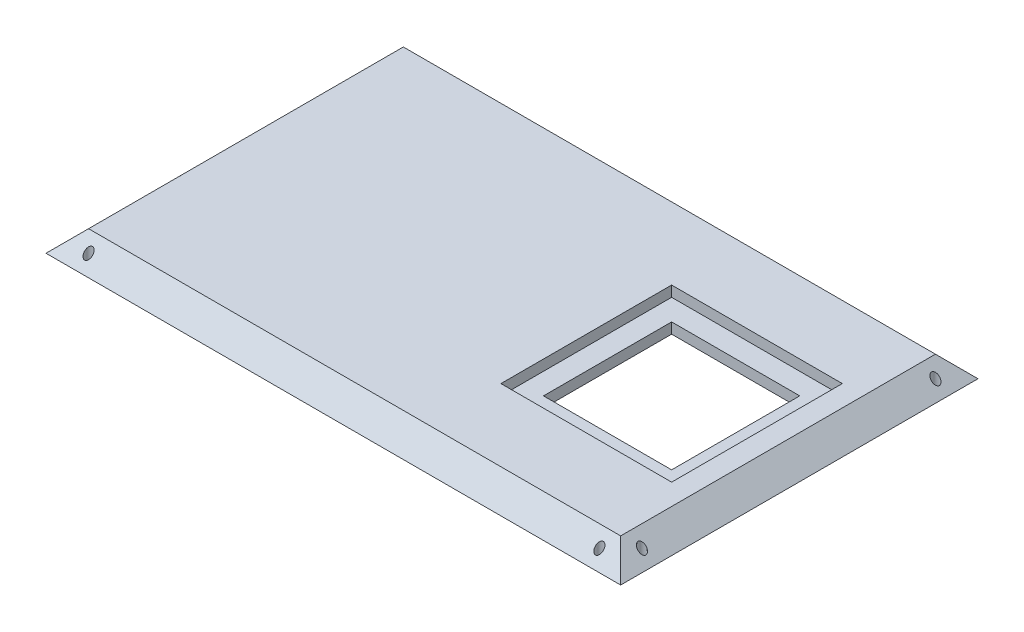
ISO-10303-21;
HEADER;
FILE_DESCRIPTION(('STEP AP214'),'2;1');
FILE_NAME('part.step','',(''),(''),'','','');
FILE_SCHEMA(('AUTOMOTIVE_DESIGN { 1 0 10303 214 1 1 1 1 }'));
ENDSEC;
DATA;
#1=APPLICATION_CONTEXT('core data for automotive mechanical design processes');
#2=APPLICATION_PROTOCOL_DEFINITION('international standard','automotive_design',2000,#1);
#3=PRODUCT_CONTEXT('',#1,'mechanical');
#4=PRODUCT('Part','Part','',(#3));
#5=PRODUCT_RELATED_PRODUCT_CATEGORY('part','',(#4));
#6=PRODUCT_DEFINITION_FORMATION('','',#4);
#7=PRODUCT_DEFINITION_CONTEXT('part definition',#1,'design');
#8=PRODUCT_DEFINITION('design','',#6,#7);
#9=PRODUCT_DEFINITION_SHAPE('','',#8);
#10=(LENGTH_UNIT() NAMED_UNIT(*) SI_UNIT(.MILLI.,.METRE.));
#11=(NAMED_UNIT(*) PLANE_ANGLE_UNIT() SI_UNIT($,.RADIAN.));
#12=(NAMED_UNIT(*) SI_UNIT($,.STERADIAN.) SOLID_ANGLE_UNIT());
#13=UNCERTAINTY_MEASURE_WITH_UNIT(LENGTH_MEASURE(1.E-05),#10,'distance_accuracy_value','');
#14=(GEOMETRIC_REPRESENTATION_CONTEXT(3) GLOBAL_UNCERTAINTY_ASSIGNED_CONTEXT((#13)) GLOBAL_UNIT_ASSIGNED_CONTEXT((#10,
#11,#12)) REPRESENTATION_CONTEXT('',''));
#15=CARTESIAN_POINT('',(0.,0.,0.));
#16=DIRECTION('',(0.,0.,1.));
#17=DIRECTION('',(1.,0.,0.));
#18=AXIS2_PLACEMENT_3D('',#15,#16,#17);
#19=CARTESIAN_POINT('',(0.,10.,0.));
#20=DIRECTION('',(0.,1.,0.));
#21=DIRECTION('',(0.,0.,1.));
#22=AXIS2_PLACEMENT_3D('',#19,#20,#21);
#23=PLANE('',#22);
#24=DIRECTION('',(-1.,0.,0.));
#25=VECTOR('',#24,1.);
#26=CARTESIAN_POINT('',(124.995764294043,10.,-73.940376121582));
#27=LINE('',#26,#25);
#28=CARTESIAN_POINT('',(124.995764294043,10.,-73.940376121582));
#29=VERTEX_POINT('',#28);
#30=CARTESIAN_POINT('',(-124.995764294043,10.,-73.940376121582));
#31=VERTEX_POINT('',#30);
#32=EDGE_CURVE('E324',#29,#31,#27,.T.);
#33=ORIENTED_EDGE('',*,*,#32,.T.);
#34=DIRECTION('',(0.,0.,1.));
#35=VECTOR('',#34,1.);
#36=CARTESIAN_POINT('',(-124.995764294043,10.,-73.940376121582));
#37=LINE('',#36,#35);
#38=CARTESIAN_POINT('',(-124.995764294043,10.,73.940376121582));
#39=VERTEX_POINT('',#38);
#40=EDGE_CURVE('E327',#31,#39,#37,.T.);
#41=ORIENTED_EDGE('',*,*,#40,.T.);
#42=DIRECTION('',(1.,0.,0.));
#43=VECTOR('',#42,1.);
#44=CARTESIAN_POINT('',(-124.995764294043,10.,73.940376121582));
#45=LINE('',#44,#43);
#46=CARTESIAN_POINT('',(124.995764294043,10.,73.940376121582));
#47=VERTEX_POINT('',#46);
#48=EDGE_CURVE('E72',#39,#47,#45,.T.);
#49=ORIENTED_EDGE('',*,*,#48,.T.);
#50=DIRECTION('',(0.,0.,-1.));
#51=VECTOR('',#50,1.);
#52=CARTESIAN_POINT('',(124.995764294043,10.,73.940376121582));
#53=LINE('',#52,#51);
#54=EDGE_CURVE('E12',#47,#29,#53,.T.);
#55=ORIENTED_EDGE('',*,*,#54,.T.);
#56=EDGE_LOOP('',(#33,#41,#49,#55));
#57=FACE_BOUND('',#56,.T.);
#58=DIRECTION('',(0.,0.,-1.));
#59=VECTOR('',#58,1.);
#60=CARTESIAN_POINT('',(115.095764294043,10.,40.1));
#61=LINE('',#60,#59);
#62=CARTESIAN_POINT('',(115.095764294043,10.,40.1));
#63=VERTEX_POINT('',#62);
#64=CARTESIAN_POINT('',(115.095764294043,10.,-40.1));
#65=VERTEX_POINT('',#64);
#66=EDGE_CURVE('E159',#63,#65,#61,.T.);
#67=ORIENTED_EDGE('',*,*,#66,.F.);
#68=DIRECTION('',(1.,0.,0.));
#69=VECTOR('',#68,1.);
#70=CARTESIAN_POINT('',(115.095764294043,10.,40.1));
#71=LINE('',#70,#69);
#72=CARTESIAN_POINT('',(34.8957642940431,10.,40.1));
#73=VERTEX_POINT('',#72);
#74=EDGE_CURVE('E451',#73,#63,#71,.T.);
#75=ORIENTED_EDGE('',*,*,#74,.F.);
#76=DIRECTION('',(0.,0.,1.));
#77=VECTOR('',#76,1.);
#78=CARTESIAN_POINT('',(34.8957642940431,10.,40.1));
#79=LINE('',#78,#77);
#80=CARTESIAN_POINT('',(34.8957642940431,10.,-40.1));
#81=VERTEX_POINT('',#80);
#82=EDGE_CURVE('E456',#81,#73,#79,.T.);
#83=ORIENTED_EDGE('',*,*,#82,.F.);
#84=DIRECTION('',(-1.,0.,0.));
#85=VECTOR('',#84,1.);
#86=CARTESIAN_POINT('',(115.095764294043,10.,-40.1));
#87=LINE('',#86,#85);
#88=EDGE_CURVE('E454',#65,#81,#87,.T.);
#89=ORIENTED_EDGE('',*,*,#88,.F.);
#90=EDGE_LOOP('',(#67,#75,#83,#89));
#91=FACE_BOUND('',#90,.T.);
#92=ADVANCED_FACE('F63',(#57,#91),#23,.T.);
#93=CARTESIAN_POINT('',(0.,0.,0.));
#94=DIRECTION('',(0.,-1.,0.));
#95=DIRECTION('',(0.,0.,-1.));
#96=AXIS2_PLACEMENT_3D('',#93,#94,#95);
#97=PLANE('',#96);
#98=DIRECTION('',(1.,0.,0.));
#99=VECTOR('',#98,1.);
#100=CARTESIAN_POINT('',(105.095764294043,0.,30.1));
#101=LINE('',#100,#99);
#102=CARTESIAN_POINT('',(44.8957642940431,0.,30.1));
#103=VERTEX_POINT('',#102);
#104=CARTESIAN_POINT('',(105.095764294043,0.,30.1));
#105=VERTEX_POINT('',#104);
#106=EDGE_CURVE('E446',#103,#105,#101,.T.);
#107=ORIENTED_EDGE('',*,*,#106,.T.);
#108=DIRECTION('',(0.,0.,-1.));
#109=VECTOR('',#108,1.);
#110=CARTESIAN_POINT('',(105.095764294043,0.,30.1));
#111=LINE('',#110,#109);
#112=CARTESIAN_POINT('',(105.095764294043,0.,-30.1));
#113=VERTEX_POINT('',#112);
#114=EDGE_CURVE('E437',#105,#113,#111,.T.);
#115=ORIENTED_EDGE('',*,*,#114,.T.);
#116=DIRECTION('',(-1.,0.,0.));
#117=VECTOR('',#116,1.);
#118=CARTESIAN_POINT('',(105.095764294043,0.,-30.1));
#119=LINE('',#118,#117);
#120=CARTESIAN_POINT('',(44.8957642940431,0.,-30.1));
#121=VERTEX_POINT('',#120);
#122=EDGE_CURVE('E434',#113,#121,#119,.T.);
#123=ORIENTED_EDGE('',*,*,#122,.T.);
#124=DIRECTION('',(0.,0.,1.));
#125=VECTOR('',#124,1.);
#126=CARTESIAN_POINT('',(44.8957642940431,0.,30.1));
#127=LINE('',#126,#125);
#128=EDGE_CURVE('E88',#121,#103,#127,.T.);
#129=ORIENTED_EDGE('',*,*,#128,.T.);
#130=EDGE_LOOP('',(#107,#115,#123,#129));
#131=FACE_BOUND('',#130,.T.);
#132=CARTESIAN_POINT('',(129.995764294043,0.,-68.940376121582));
#133=DIRECTION('',(0.,-1.,0.));
#134=DIRECTION('',(0.,0.,1.));
#135=AXIS2_PLACEMENT_3D('',#132,#133,#134);
#136=CIRCLE('',#135,1.85000000000001);
#137=CARTESIAN_POINT('',(129.995764294043,0.,-67.090376121582));
#138=VERTEX_POINT('',#137);
#139=EDGE_CURVE('E508',#138,#138,#136,.T.);
#140=ORIENTED_EDGE('',*,*,#139,.F.);
#141=EDGE_LOOP('',(#140));
#142=FACE_BOUND('',#141,.T.);
#143=CARTESIAN_POINT('',(119.995764294043,0.,78.940376121582));
#144=DIRECTION('',(0.,-1.,0.));
#145=DIRECTION('',(0.,0.,1.));
#146=AXIS2_PLACEMENT_3D('',#143,#144,#145);
#147=CIRCLE('',#146,1.84999999999999);
#148=CARTESIAN_POINT('',(119.995764294043,0.,80.790376121582));
#149=VERTEX_POINT('',#148);
#150=EDGE_CURVE('E511',#149,#149,#147,.T.);
#151=ORIENTED_EDGE('',*,*,#150,.F.);
#152=EDGE_LOOP('',(#151));
#153=FACE_BOUND('',#152,.T.);
#154=CARTESIAN_POINT('',(129.995764294043,0.,68.940376121582));
#155=DIRECTION('',(0.,-1.,0.));
#156=DIRECTION('',(0.,0.,-1.));
#157=AXIS2_PLACEMENT_3D('',#154,#155,#156);
#158=CIRCLE('',#157,1.85000000000001);
#159=CARTESIAN_POINT('',(129.995764294043,0.,67.090376121582));
#160=VERTEX_POINT('',#159);
#161=EDGE_CURVE('E514',#160,#160,#158,.T.);
#162=ORIENTED_EDGE('',*,*,#161,.F.);
#163=EDGE_LOOP('',(#162));
#164=FACE_BOUND('',#163,.T.);
#165=CARTESIAN_POINT('',(-129.995764294043,0.,68.9403761215819));
#166=DIRECTION('',(0.,-1.,0.));
#167=DIRECTION('',(0.,0.,1.));
#168=AXIS2_PLACEMENT_3D('',#165,#166,#167);
#169=CIRCLE('',#168,1.85000000000001);
#170=CARTESIAN_POINT('',(-129.995764294043,0.,70.790376121582));
#171=VERTEX_POINT('',#170);
#172=EDGE_CURVE('E517',#171,#171,#169,.T.);
#173=ORIENTED_EDGE('',*,*,#172,.F.);
#174=EDGE_LOOP('',(#173));
#175=FACE_BOUND('',#174,.T.);
#176=CARTESIAN_POINT('',(-119.995764294043,0.,-78.940376121582));
#177=DIRECTION('',(0.,-1.,0.));
#178=DIRECTION('',(0.,0.,1.));
#179=AXIS2_PLACEMENT_3D('',#176,#177,#178);
#180=CIRCLE('',#179,1.84999999999999);
#181=CARTESIAN_POINT('',(-119.995764294043,0.,-77.090376121582));
#182=VERTEX_POINT('',#181);
#183=EDGE_CURVE('E472',#182,#182,#180,.T.);
#184=ORIENTED_EDGE('',*,*,#183,.F.);
#185=EDGE_LOOP('',(#184));
#186=FACE_BOUND('',#185,.T.);
#187=CARTESIAN_POINT('',(-129.995764294043,0.,-68.9403761215819));
#188=DIRECTION('',(0.,-1.,0.));
#189=DIRECTION('',(0.,0.,-1.));
#190=AXIS2_PLACEMENT_3D('',#187,#188,#189);
#191=CIRCLE('',#190,1.85000000000001);
#192=CARTESIAN_POINT('',(-129.995764294043,0.,-70.790376121582));
#193=VERTEX_POINT('',#192);
#194=EDGE_CURVE('E504',#193,#193,#191,.T.);
#195=ORIENTED_EDGE('',*,*,#194,.F.);
#196=EDGE_LOOP('',(#195));
#197=FACE_BOUND('',#196,.T.);
#198=CARTESIAN_POINT('',(119.995764294043,0.,-78.940376121582));
#199=DIRECTION('',(0.,-1.,0.));
#200=DIRECTION('',(0.,0.,-1.));
#201=AXIS2_PLACEMENT_3D('',#198,#199,#200);
#202=CIRCLE('',#201,1.84999999999999);
#203=CARTESIAN_POINT('',(119.995764294043,0.,-80.790376121582));
#204=VERTEX_POINT('',#203);
#205=EDGE_CURVE('E505',#204,#204,#202,.T.);
#206=ORIENTED_EDGE('',*,*,#205,.F.);
#207=EDGE_LOOP('',(#206));
#208=FACE_BOUND('',#207,.T.);
#209=CARTESIAN_POINT('',(-119.995764294043,0.,78.940376121582));
#210=DIRECTION('',(0.,-1.,0.));
#211=DIRECTION('',(0.,0.,-1.));
#212=AXIS2_PLACEMENT_3D('',#209,#210,#211);
#213=CIRCLE('',#212,1.84999999999999);
#214=CARTESIAN_POINT('',(-119.995764294043,0.,77.090376121582));
#215=VERTEX_POINT('',#214);
#216=EDGE_CURVE('E414',#215,#215,#213,.T.);
#217=ORIENTED_EDGE('',*,*,#216,.F.);
#218=EDGE_LOOP('',(#217));
#219=FACE_BOUND('',#218,.T.);
#220=DIRECTION('',(0.,0.,-1.));
#221=VECTOR('',#220,1.);
#222=CARTESIAN_POINT('',(134.995764294043,0.,83.940376121582));
#223=LINE('',#222,#221);
#224=CARTESIAN_POINT('',(134.995764294043,0.,83.940376121582));
#225=VERTEX_POINT('',#224);
#226=CARTESIAN_POINT('',(134.995764294043,0.,-83.940376121582));
#227=VERTEX_POINT('',#226);
#228=EDGE_CURVE('E288',#225,#227,#223,.T.);
#229=ORIENTED_EDGE('',*,*,#228,.F.);
#230=DIRECTION('',(1.,0.,0.));
#231=VECTOR('',#230,1.);
#232=CARTESIAN_POINT('',(-134.995764294043,0.,83.940376121582));
#233=LINE('',#232,#231);
#234=CARTESIAN_POINT('',(-134.995764294043,0.,83.940376121582));
#235=VERTEX_POINT('',#234);
#236=EDGE_CURVE('E292',#235,#225,#233,.T.);
#237=ORIENTED_EDGE('',*,*,#236,.F.);
#238=DIRECTION('',(0.,0.,1.));
#239=VECTOR('',#238,1.);
#240=CARTESIAN_POINT('',(-134.995764294043,0.,83.940376121582));
#241=LINE('',#240,#239);
#242=CARTESIAN_POINT('',(-134.995764294043,0.,-83.940376121582));
#243=VERTEX_POINT('',#242);
#244=EDGE_CURVE('E287',#243,#235,#241,.T.);
#245=ORIENTED_EDGE('',*,*,#244,.F.);
#246=DIRECTION('',(-1.,0.,0.));
#247=VECTOR('',#246,1.);
#248=CARTESIAN_POINT('',(-134.995764294043,0.,-83.940376121582));
#249=LINE('',#248,#247);
#250=EDGE_CURVE('E279',#227,#243,#249,.T.);
#251=ORIENTED_EDGE('',*,*,#250,.F.);
#252=EDGE_LOOP('',(#229,#237,#245,#251));
#253=FACE_BOUND('',#252,.T.);
#254=ADVANCED_FACE('F251',(#131,#142,#153,#164,#175,#186,#197,#208,#219,#253),#97,.T.);
#255=CARTESIAN_POINT('',(67.4978821470215,67.4978821470216,0.));
#256=DIRECTION('',(-0.707106781186547,-0.707106781186548,0.));
#257=DIRECTION('',(0.707106781186548,-0.707106781186547,0.));
#258=AXIS2_PLACEMENT_3D('',#255,#256,#257);
#259=PLANE('',#258);
#260=CARTESIAN_POINT('',(129.995764294043,5.00000000000001,-68.940376121582));
#261=DIRECTION('',(-0.707106781186547,-0.707106781186548,0.));
#262=DIRECTION('',(0.707106781186548,-0.707106781186547,0.));
#263=AXIS2_PLACEMENT_3D('',#260,#261,#262);
#264=ELLIPSE('',#263,2.61629509039023,1.85000000000001);
#265=CARTESIAN_POINT('',(131.845764294043,3.15000000000001,-68.940376121582));
#266=VERTEX_POINT('',#265);
#267=EDGE_CURVE('E306',#266,#266,#264,.T.);
#268=ORIENTED_EDGE('',*,*,#267,.T.);
#269=EDGE_LOOP('',(#268));
#270=FACE_BOUND('',#269,.T.);
#271=CARTESIAN_POINT('',(129.995764294043,5.00000000000001,68.940376121582));
#272=DIRECTION('',(-0.707106781186547,-0.707106781186548,0.));
#273=DIRECTION('',(0.707106781186548,-0.707106781186547,0.));
#274=AXIS2_PLACEMENT_3D('',#271,#272,#273);
#275=ELLIPSE('',#274,2.61629509039023,1.85000000000001);
#276=CARTESIAN_POINT('',(131.845764294043,3.15000000000001,68.940376121582));
#277=VERTEX_POINT('',#276);
#278=EDGE_CURVE('E429',#277,#277,#275,.T.);
#279=ORIENTED_EDGE('',*,*,#278,.T.);
#280=EDGE_LOOP('',(#279));
#281=FACE_BOUND('',#280,.T.);
#282=DIRECTION('',(-0.577350269189626,0.577350269189626,0.577350269189625));
#283=VECTOR('',#282,1.);
#284=CARTESIAN_POINT('',(134.995764294043,0.,-83.940376121582));
#285=LINE('',#284,#283);
#286=EDGE_CURVE('E297',#227,#29,#285,.T.);
#287=ORIENTED_EDGE('',*,*,#286,.T.);
#288=ORIENTED_EDGE('',*,*,#54,.F.);
#289=DIRECTION('',(-0.577350269189626,0.577350269189626,-0.577350269189625));
#290=VECTOR('',#289,1.);
#291=CARTESIAN_POINT('',(134.995764294043,0.,83.940376121582));
#292=LINE('',#291,#290);
#293=EDGE_CURVE('E329',#225,#47,#292,.T.);
#294=ORIENTED_EDGE('',*,*,#293,.F.);
#295=ORIENTED_EDGE('',*,*,#228,.T.);
#296=EDGE_LOOP('',(#287,#288,#294,#295));
#297=FACE_BOUND('',#296,.T.);
#298=ADVANCED_FACE('F255',(#270,#281,#297),#259,.F.);
#299=CARTESIAN_POINT('',(0.,41.970188060791,41.970188060791));
#300=DIRECTION('',(0.,-0.707106781186547,-0.707106781186548));
#301=DIRECTION('',(0.,0.707106781186548,-0.707106781186547));
#302=AXIS2_PLACEMENT_3D('',#299,#300,#301);
#303=PLANE('',#302);
#304=CARTESIAN_POINT('',(119.995764294043,5.,78.940376121582));
#305=DIRECTION('',(0.,-0.707106781186547,-0.707106781186548));
#306=DIRECTION('',(0.,-0.707106781186548,0.707106781186547));
#307=AXIS2_PLACEMENT_3D('',#304,#305,#306);
#308=ELLIPSE('',#307,2.61629509039021,1.84999999999999);
#309=CARTESIAN_POINT('',(119.995764294043,3.15000000000001,80.790376121582));
#310=VERTEX_POINT('',#309);
#311=EDGE_CURVE('E426',#310,#310,#308,.T.);
#312=ORIENTED_EDGE('',*,*,#311,.T.);
#313=EDGE_LOOP('',(#312));
#314=FACE_BOUND('',#313,.T.);
#315=CARTESIAN_POINT('',(-119.995764294043,5.00000000000003,78.940376121582));
#316=DIRECTION('',(0.,-0.707106781186547,-0.707106781186548));
#317=DIRECTION('',(0.,-0.707106781186548,0.707106781186547));
#318=AXIS2_PLACEMENT_3D('',#315,#316,#317);
#319=ELLIPSE('',#318,2.61629509039021,1.84999999999999);
#320=CARTESIAN_POINT('',(-119.995764294043,3.15000000000004,80.790376121582));
#321=VERTEX_POINT('',#320);
#322=EDGE_CURVE('E423',#321,#321,#319,.T.);
#323=ORIENTED_EDGE('',*,*,#322,.T.);
#324=EDGE_LOOP('',(#323));
#325=FACE_BOUND('',#324,.T.);
#326=ORIENTED_EDGE('',*,*,#293,.T.);
#327=ORIENTED_EDGE('',*,*,#48,.F.);
#328=DIRECTION('',(0.577350269189626,0.577350269189626,-0.577350269189625));
#329=VECTOR('',#328,1.);
#330=CARTESIAN_POINT('',(-134.995764294043,0.,83.940376121582));
#331=LINE('',#330,#329);
#332=EDGE_CURVE('E316',#235,#39,#331,.T.);
#333=ORIENTED_EDGE('',*,*,#332,.F.);
#334=ORIENTED_EDGE('',*,*,#236,.T.);
#335=EDGE_LOOP('',(#326,#327,#333,#334));
#336=FACE_BOUND('',#335,.T.);
#337=ADVANCED_FACE('F322',(#314,#325,#336),#303,.F.);
#338=CARTESIAN_POINT('',(0.,41.970188060791,-41.970188060791));
#339=DIRECTION('',(0.,-0.707106781186547,0.707106781186548));
#340=DIRECTION('',(0.,-0.707106781186548,-0.707106781186547));
#341=AXIS2_PLACEMENT_3D('',#338,#339,#340);
#342=PLANE('',#341);
#343=CARTESIAN_POINT('',(-119.995764294043,5.00000000000003,-78.940376121582));
#344=DIRECTION('',(0.,-0.707106781186547,0.707106781186548));
#345=DIRECTION('',(0.,-0.707106781186548,-0.707106781186547));
#346=AXIS2_PLACEMENT_3D('',#343,#344,#345);
#347=ELLIPSE('',#346,2.61629509039021,1.84999999999999);
#348=CARTESIAN_POINT('',(-119.995764294043,3.15000000000004,-80.790376121582));
#349=VERTEX_POINT('',#348);
#350=EDGE_CURVE('E420',#349,#349,#347,.T.);
#351=ORIENTED_EDGE('',*,*,#350,.T.);
#352=EDGE_LOOP('',(#351));
#353=FACE_BOUND('',#352,.T.);
#354=CARTESIAN_POINT('',(119.995764294043,5.,-78.940376121582));
#355=DIRECTION('',(0.,-0.707106781186547,0.707106781186548));
#356=DIRECTION('',(0.,-0.707106781186548,-0.707106781186547));
#357=AXIS2_PLACEMENT_3D('',#354,#355,#356);
#358=ELLIPSE('',#357,2.61629509039021,1.84999999999999);
#359=CARTESIAN_POINT('',(119.995764294043,3.15000000000001,-80.790376121582));
#360=VERTEX_POINT('',#359);
#361=EDGE_CURVE('E417',#360,#360,#358,.T.);
#362=ORIENTED_EDGE('',*,*,#361,.T.);
#363=EDGE_LOOP('',(#362));
#364=FACE_BOUND('',#363,.T.);
#365=DIRECTION('',(0.577350269189626,0.577350269189626,0.577350269189625));
#366=VECTOR('',#365,1.);
#367=CARTESIAN_POINT('',(-134.995764294043,0.,-83.940376121582));
#368=LINE('',#367,#366);
#369=EDGE_CURVE('E319',#243,#31,#368,.T.);
#370=ORIENTED_EDGE('',*,*,#369,.T.);
#371=ORIENTED_EDGE('',*,*,#32,.F.);
#372=ORIENTED_EDGE('',*,*,#286,.F.);
#373=ORIENTED_EDGE('',*,*,#250,.T.);
#374=EDGE_LOOP('',(#370,#371,#372,#373));
#375=FACE_BOUND('',#374,.T.);
#376=ADVANCED_FACE('F360',(#353,#364,#375),#342,.F.);
#377=CARTESIAN_POINT('',(-67.4978821470215,67.4978821470216,0.));
#378=DIRECTION('',(0.707106781186547,-0.707106781186548,0.));
#379=DIRECTION('',(0.707106781186548,0.707106781186547,0.));
#380=AXIS2_PLACEMENT_3D('',#377,#378,#379);
#381=PLANE('',#380);
#382=CARTESIAN_POINT('',(-129.995764294043,5.00000000000001,68.9403761215819));
#383=DIRECTION('',(0.707106781186547,-0.707106781186548,0.));
#384=DIRECTION('',(-0.707106781186548,-0.707106781186547,0.));
#385=AXIS2_PLACEMENT_3D('',#382,#383,#384);
#386=ELLIPSE('',#385,2.61629509039023,1.85000000000001);
#387=CARTESIAN_POINT('',(-131.845764294043,3.15000000000001,68.9403761215819));
#388=VERTEX_POINT('',#387);
#389=EDGE_CURVE('E413',#388,#388,#386,.T.);
#390=ORIENTED_EDGE('',*,*,#389,.T.);
#391=EDGE_LOOP('',(#390));
#392=FACE_BOUND('',#391,.T.);
#393=CARTESIAN_POINT('',(-129.995764294043,5.00000000000001,-68.9403761215819));
#394=DIRECTION('',(0.707106781186547,-0.707106781186548,0.));
#395=DIRECTION('',(-0.707106781186548,-0.707106781186547,0.));
#396=AXIS2_PLACEMENT_3D('',#393,#394,#395);
#397=ELLIPSE('',#396,2.61629509039023,1.85000000000001);
#398=CARTESIAN_POINT('',(-131.845764294043,3.15000000000001,-68.9403761215819));
#399=VERTEX_POINT('',#398);
#400=EDGE_CURVE('E405',#399,#399,#397,.T.);
#401=ORIENTED_EDGE('',*,*,#400,.T.);
#402=EDGE_LOOP('',(#401));
#403=FACE_BOUND('',#402,.T.);
#404=ORIENTED_EDGE('',*,*,#332,.T.);
#405=ORIENTED_EDGE('',*,*,#40,.F.);
#406=ORIENTED_EDGE('',*,*,#369,.F.);
#407=ORIENTED_EDGE('',*,*,#244,.T.);
#408=EDGE_LOOP('',(#404,#405,#406,#407));
#409=FACE_BOUND('',#408,.T.);
#410=ADVANCED_FACE('F232',(#392,#403,#409),#381,.F.);
#411=CARTESIAN_POINT('',(-129.995764294043,10.0001,-68.9403761215819));
#412=DIRECTION('',(0.,-1.,0.));
#413=DIRECTION('',(0.,0.,-1.));
#414=AXIS2_PLACEMENT_3D('',#411,#412,#413);
#415=CYLINDRICAL_SURFACE('',#414,1.85000000000001);
#416=ORIENTED_EDGE('',*,*,#194,.T.);
#417=EDGE_LOOP('',(#416));
#418=FACE_BOUND('',#417,.T.);
#419=ORIENTED_EDGE('',*,*,#400,.F.);
#420=EDGE_LOOP('',(#419));
#421=FACE_BOUND('',#420,.T.);
#422=ADVANCED_FACE('F229',(#418,#421),#415,.F.);
#423=CARTESIAN_POINT('',(-129.995764294043,10.0001,68.9403761215819));
#424=DIRECTION('',(0.,-1.,0.));
#425=DIRECTION('',(0.,0.,-1.));
#426=AXIS2_PLACEMENT_3D('',#423,#424,#425);
#427=CYLINDRICAL_SURFACE('',#426,1.85000000000001);
#428=ORIENTED_EDGE('',*,*,#172,.T.);
#429=EDGE_LOOP('',(#428));
#430=FACE_BOUND('',#429,.T.);
#431=ORIENTED_EDGE('',*,*,#389,.F.);
#432=EDGE_LOOP('',(#431));
#433=FACE_BOUND('',#432,.T.);
#434=ADVANCED_FACE('F227',(#430,#433),#427,.F.);
#435=CARTESIAN_POINT('',(119.995764294043,10.0001,-78.940376121582));
#436=DIRECTION('',(0.,-1.,0.));
#437=DIRECTION('',(0.,0.,-1.));
#438=AXIS2_PLACEMENT_3D('',#435,#436,#437);
#439=CYLINDRICAL_SURFACE('',#438,1.84999999999999);
#440=ORIENTED_EDGE('',*,*,#205,.T.);
#441=EDGE_LOOP('',(#440));
#442=FACE_BOUND('',#441,.T.);
#443=ORIENTED_EDGE('',*,*,#361,.F.);
#444=EDGE_LOOP('',(#443));
#445=FACE_BOUND('',#444,.T.);
#446=ADVANCED_FACE('F223',(#442,#445),#439,.F.);
#447=CARTESIAN_POINT('',(-119.995764294043,10.0001,-78.940376121582));
#448=DIRECTION('',(0.,-1.,0.));
#449=DIRECTION('',(0.,0.,-1.));
#450=AXIS2_PLACEMENT_3D('',#447,#448,#449);
#451=CYLINDRICAL_SURFACE('',#450,1.84999999999999);
#452=ORIENTED_EDGE('',*,*,#183,.T.);
#453=EDGE_LOOP('',(#452));
#454=FACE_BOUND('',#453,.T.);
#455=ORIENTED_EDGE('',*,*,#350,.F.);
#456=EDGE_LOOP('',(#455));
#457=FACE_BOUND('',#456,.T.);
#458=ADVANCED_FACE('F219',(#454,#457),#451,.F.);
#459=CARTESIAN_POINT('',(-119.995764294043,10.0001,78.940376121582));
#460=DIRECTION('',(0.,-1.,0.));
#461=DIRECTION('',(0.,0.,-1.));
#462=AXIS2_PLACEMENT_3D('',#459,#460,#461);
#463=CYLINDRICAL_SURFACE('',#462,1.84999999999999);
#464=ORIENTED_EDGE('',*,*,#216,.T.);
#465=EDGE_LOOP('',(#464));
#466=FACE_BOUND('',#465,.T.);
#467=ORIENTED_EDGE('',*,*,#322,.F.);
#468=EDGE_LOOP('',(#467));
#469=FACE_BOUND('',#468,.T.);
#470=ADVANCED_FACE('F222',(#466,#469),#463,.F.);
#471=CARTESIAN_POINT('',(119.995764294043,10.0001,78.940376121582));
#472=DIRECTION('',(0.,-1.,0.));
#473=DIRECTION('',(0.,0.,-1.));
#474=AXIS2_PLACEMENT_3D('',#471,#472,#473);
#475=CYLINDRICAL_SURFACE('',#474,1.84999999999999);
#476=ORIENTED_EDGE('',*,*,#150,.T.);
#477=EDGE_LOOP('',(#476));
#478=FACE_BOUND('',#477,.T.);
#479=ORIENTED_EDGE('',*,*,#311,.F.);
#480=EDGE_LOOP('',(#479));
#481=FACE_BOUND('',#480,.T.);
#482=ADVANCED_FACE('F234',(#478,#481),#475,.F.);
#483=CARTESIAN_POINT('',(129.995764294043,10.0001,68.940376121582));
#484=DIRECTION('',(0.,-1.,0.));
#485=DIRECTION('',(0.,0.,-1.));
#486=AXIS2_PLACEMENT_3D('',#483,#484,#485);
#487=CYLINDRICAL_SURFACE('',#486,1.85000000000001);
#488=ORIENTED_EDGE('',*,*,#161,.T.);
#489=EDGE_LOOP('',(#488));
#490=FACE_BOUND('',#489,.T.);
#491=ORIENTED_EDGE('',*,*,#278,.F.);
#492=EDGE_LOOP('',(#491));
#493=FACE_BOUND('',#492,.T.);
#494=ADVANCED_FACE('F237',(#490,#493),#487,.F.);
#495=CARTESIAN_POINT('',(129.995764294043,10.0001,-68.940376121582));
#496=DIRECTION('',(0.,-1.,0.));
#497=DIRECTION('',(0.,0.,-1.));
#498=AXIS2_PLACEMENT_3D('',#495,#496,#497);
#499=CYLINDRICAL_SURFACE('',#498,1.85000000000001);
#500=ORIENTED_EDGE('',*,*,#139,.T.);
#501=EDGE_LOOP('',(#500));
#502=FACE_BOUND('',#501,.T.);
#503=ORIENTED_EDGE('',*,*,#267,.F.);
#504=EDGE_LOOP('',(#503));
#505=FACE_BOUND('',#504,.T.);
#506=ADVANCED_FACE('F207',(#502,#505),#499,.F.);
#507=CARTESIAN_POINT('',(0.,0.,30.1));
#508=DIRECTION('',(0.,0.,1.));
#509=DIRECTION('',(1.,0.,0.));
#510=AXIS2_PLACEMENT_3D('',#507,#508,#509);
#511=PLANE('',#510);
#512=DIRECTION('',(0.,1.,0.));
#513=VECTOR('',#512,1.);
#514=CARTESIAN_POINT('',(105.095764294043,0.,30.1));
#515=LINE('',#514,#513);
#516=CARTESIAN_POINT('',(105.095764294043,5.,30.1));
#517=VERTEX_POINT('',#516);
#518=EDGE_CURVE('E442',#105,#517,#515,.T.);
#519=ORIENTED_EDGE('',*,*,#518,.F.);
#520=ORIENTED_EDGE('',*,*,#106,.F.);
#521=DIRECTION('',(0.,1.,0.));
#522=VECTOR('',#521,1.);
#523=CARTESIAN_POINT('',(44.8957642940431,0.,30.1));
#524=LINE('',#523,#522);
#525=CARTESIAN_POINT('',(44.8957642940431,5.,30.1));
#526=VERTEX_POINT('',#525);
#527=EDGE_CURVE('E491',#103,#526,#524,.T.);
#528=ORIENTED_EDGE('',*,*,#527,.T.);
#529=DIRECTION('',(-1.,0.,0.));
#530=VECTOR('',#529,1.);
#531=CARTESIAN_POINT('',(105.095764294043,5.,30.1));
#532=LINE('',#531,#530);
#533=EDGE_CURVE('E482',#517,#526,#532,.T.);
#534=ORIENTED_EDGE('',*,*,#533,.F.);
#535=EDGE_LOOP('',(#519,#520,#528,#534));
#536=FACE_BOUND('',#535,.T.);
#537=ADVANCED_FACE('F203',(#536),#511,.F.);
#538=CARTESIAN_POINT('',(44.8957642940431,0.,0.));
#539=DIRECTION('',(-1.,0.,0.));
#540=DIRECTION('',(0.,0.,1.));
#541=AXIS2_PLACEMENT_3D('',#538,#539,#540);
#542=PLANE('',#541);
#543=ORIENTED_EDGE('',*,*,#527,.F.);
#544=ORIENTED_EDGE('',*,*,#128,.F.);
#545=DIRECTION('',(0.,1.,0.));
#546=VECTOR('',#545,1.);
#547=CARTESIAN_POINT('',(44.8957642940431,0.,-30.1));
#548=LINE('',#547,#546);
#549=CARTESIAN_POINT('',(44.8957642940431,5.,-30.1));
#550=VERTEX_POINT('',#549);
#551=EDGE_CURVE('E484',#121,#550,#548,.T.);
#552=ORIENTED_EDGE('',*,*,#551,.T.);
#553=DIRECTION('',(0.,0.,-1.));
#554=VECTOR('',#553,1.);
#555=CARTESIAN_POINT('',(44.8957642940431,5.,30.1));
#556=LINE('',#555,#554);
#557=EDGE_CURVE('E478',#526,#550,#556,.T.);
#558=ORIENTED_EDGE('',*,*,#557,.F.);
#559=EDGE_LOOP('',(#543,#544,#552,#558));
#560=FACE_BOUND('',#559,.T.);
#561=ADVANCED_FACE('F206',(#560),#542,.F.);
#562=CARTESIAN_POINT('',(105.095764294043,0.,0.));
#563=DIRECTION('',(-1.,0.,0.));
#564=DIRECTION('',(0.,0.,1.));
#565=AXIS2_PLACEMENT_3D('',#562,#563,#564);
#566=PLANE('',#565);
#567=DIRECTION('',(0.,1.,0.));
#568=VECTOR('',#567,1.);
#569=CARTESIAN_POINT('',(105.095764294043,0.,-30.1));
#570=LINE('',#569,#568);
#571=CARTESIAN_POINT('',(105.095764294043,5.,-30.1));
#572=VERTEX_POINT('',#571);
#573=EDGE_CURVE('E488',#113,#572,#570,.T.);
#574=ORIENTED_EDGE('',*,*,#573,.F.);
#575=ORIENTED_EDGE('',*,*,#114,.F.);
#576=ORIENTED_EDGE('',*,*,#518,.T.);
#577=DIRECTION('',(0.,0.,-1.));
#578=VECTOR('',#577,1.);
#579=CARTESIAN_POINT('',(105.095764294043,5.,30.1));
#580=LINE('',#579,#578);
#581=EDGE_CURVE('E469',#517,#572,#580,.T.);
#582=ORIENTED_EDGE('',*,*,#581,.T.);
#583=EDGE_LOOP('',(#574,#575,#576,#582));
#584=FACE_BOUND('',#583,.T.);
#585=ADVANCED_FACE('F211',(#584),#566,.T.);
#586=CARTESIAN_POINT('',(0.,0.,-30.1));
#587=DIRECTION('',(0.,0.,1.));
#588=DIRECTION('',(1.,0.,0.));
#589=AXIS2_PLACEMENT_3D('',#586,#587,#588);
#590=PLANE('',#589);
#591=ORIENTED_EDGE('',*,*,#551,.F.);
#592=ORIENTED_EDGE('',*,*,#122,.F.);
#593=ORIENTED_EDGE('',*,*,#573,.T.);
#594=DIRECTION('',(-1.,0.,0.));
#595=VECTOR('',#594,1.);
#596=CARTESIAN_POINT('',(105.095764294043,5.,-30.1));
#597=LINE('',#596,#595);
#598=EDGE_CURVE('E473',#572,#550,#597,.T.);
#599=ORIENTED_EDGE('',*,*,#598,.T.);
#600=EDGE_LOOP('',(#591,#592,#593,#599));
#601=FACE_BOUND('',#600,.T.);
#602=ADVANCED_FACE('F214',(#601),#590,.T.);
#603=CARTESIAN_POINT('',(0.,5.,0.));
#604=DIRECTION('',(0.,-1.,0.));
#605=DIRECTION('',(0.,0.,-1.));
#606=AXIS2_PLACEMENT_3D('',#603,#604,#605);
#607=PLANE('',#606);
#608=ORIENTED_EDGE('',*,*,#533,.T.);
#609=ORIENTED_EDGE('',*,*,#557,.T.);
#610=ORIENTED_EDGE('',*,*,#598,.F.);
#611=ORIENTED_EDGE('',*,*,#581,.F.);
#612=EDGE_LOOP('',(#608,#609,#610,#611));
#613=FACE_BOUND('',#612,.T.);
#614=DIRECTION('',(-1.,0.,0.));
#615=VECTOR('',#614,1.);
#616=CARTESIAN_POINT('',(115.095764294043,5.,40.1));
#617=LINE('',#616,#615);
#618=CARTESIAN_POINT('',(115.095764294043,5.,40.1));
#619=VERTEX_POINT('',#618);
#620=CARTESIAN_POINT('',(34.8957642940431,5.,40.1));
#621=VERTEX_POINT('',#620);
#622=EDGE_CURVE('E171',#619,#621,#617,.T.);
#623=ORIENTED_EDGE('',*,*,#622,.F.);
#624=DIRECTION('',(0.,0.,-1.));
#625=VECTOR('',#624,1.);
#626=CARTESIAN_POINT('',(115.095764294043,5.,40.1));
#627=LINE('',#626,#625);
#628=CARTESIAN_POINT('',(115.095764294043,5.,-40.1));
#629=VERTEX_POINT('',#628);
#630=EDGE_CURVE('E155',#619,#629,#627,.T.);
#631=ORIENTED_EDGE('',*,*,#630,.T.);
#632=DIRECTION('',(-1.,0.,0.));
#633=VECTOR('',#632,1.);
#634=CARTESIAN_POINT('',(115.095764294043,5.,-40.1));
#635=LINE('',#634,#633);
#636=CARTESIAN_POINT('',(34.8957642940431,5.,-40.1));
#637=VERTEX_POINT('',#636);
#638=EDGE_CURVE('E167',#629,#637,#635,.T.);
#639=ORIENTED_EDGE('',*,*,#638,.T.);
#640=DIRECTION('',(0.,0.,-1.));
#641=VECTOR('',#640,1.);
#642=CARTESIAN_POINT('',(34.8957642940431,5.,40.1));
#643=LINE('',#642,#641);
#644=EDGE_CURVE('E182',#621,#637,#643,.T.);
#645=ORIENTED_EDGE('',*,*,#644,.F.);
#646=EDGE_LOOP('',(#623,#631,#639,#645));
#647=FACE_BOUND('',#646,.T.);
#648=ADVANCED_FACE('F166',(#613,#647),#607,.F.);
#649=CARTESIAN_POINT('',(0.,0.,40.1));
#650=DIRECTION('',(0.,0.,-1.));
#651=DIRECTION('',(-1.,0.,0.));
#652=AXIS2_PLACEMENT_3D('',#649,#650,#651);
#653=PLANE('',#652);
#654=DIRECTION('',(0.,1.,0.));
#655=VECTOR('',#654,1.);
#656=CARTESIAN_POINT('',(115.095764294043,5.,40.1));
#657=LINE('',#656,#655);
#658=EDGE_CURVE('E174',#619,#63,#657,.T.);
#659=ORIENTED_EDGE('',*,*,#658,.F.);
#660=ORIENTED_EDGE('',*,*,#622,.T.);
#661=DIRECTION('',(0.,1.,0.));
#662=VECTOR('',#661,1.);
#663=CARTESIAN_POINT('',(34.8957642940431,5.,40.1));
#664=LINE('',#663,#662);
#665=EDGE_CURVE('E162',#621,#73,#664,.T.);
#666=ORIENTED_EDGE('',*,*,#665,.T.);
#667=ORIENTED_EDGE('',*,*,#74,.T.);
#668=EDGE_LOOP('',(#659,#660,#666,#667));
#669=FACE_BOUND('',#668,.T.);
#670=ADVANCED_FACE('F635',(#669),#653,.T.);
#671=CARTESIAN_POINT('',(34.8957642940431,0.,0.));
#672=DIRECTION('',(1.,0.,0.));
#673=DIRECTION('',(0.,0.,-1.));
#674=AXIS2_PLACEMENT_3D('',#671,#672,#673);
#675=PLANE('',#674);
#676=ORIENTED_EDGE('',*,*,#665,.F.);
#677=ORIENTED_EDGE('',*,*,#644,.T.);
#678=DIRECTION('',(0.,1.,0.));
#679=VECTOR('',#678,1.);
#680=CARTESIAN_POINT('',(34.8957642940431,5.,-40.1));
#681=LINE('',#680,#679);
#682=EDGE_CURVE('E161',#637,#81,#681,.T.);
#683=ORIENTED_EDGE('',*,*,#682,.T.);
#684=ORIENTED_EDGE('',*,*,#82,.T.);
#685=EDGE_LOOP('',(#676,#677,#683,#684));
#686=FACE_BOUND('',#685,.T.);
#687=ADVANCED_FACE('F642',(#686),#675,.T.);
#688=CARTESIAN_POINT('',(115.095764294043,0.,0.));
#689=DIRECTION('',(-1.,0.,0.));
#690=DIRECTION('',(0.,0.,1.));
#691=AXIS2_PLACEMENT_3D('',#688,#689,#690);
#692=PLANE('',#691);
#693=DIRECTION('',(0.,1.,0.));
#694=VECTOR('',#693,1.);
#695=CARTESIAN_POINT('',(115.095764294043,5.,-40.1));
#696=LINE('',#695,#694);
#697=EDGE_CURVE('E80',#629,#65,#696,.T.);
#698=ORIENTED_EDGE('',*,*,#697,.F.);
#699=ORIENTED_EDGE('',*,*,#630,.F.);
#700=ORIENTED_EDGE('',*,*,#658,.T.);
#701=ORIENTED_EDGE('',*,*,#66,.T.);
#702=EDGE_LOOP('',(#698,#699,#700,#701));
#703=FACE_BOUND('',#702,.T.);
#704=ADVANCED_FACE('F153',(#703),#692,.T.);
#705=CARTESIAN_POINT('',(0.,0.,-40.1));
#706=DIRECTION('',(0.,0.,1.));
#707=DIRECTION('',(1.,0.,0.));
#708=AXIS2_PLACEMENT_3D('',#705,#706,#707);
#709=PLANE('',#708);
#710=ORIENTED_EDGE('',*,*,#682,.F.);
#711=ORIENTED_EDGE('',*,*,#638,.F.);
#712=ORIENTED_EDGE('',*,*,#697,.T.);
#713=ORIENTED_EDGE('',*,*,#88,.T.);
#714=EDGE_LOOP('',(#710,#711,#712,#713));
#715=FACE_BOUND('',#714,.T.);
#716=ADVANCED_FACE('F179',(#715),#709,.T.);
#717=CLOSED_SHELL('',(#92,#254,#298,#337,#376,#410,#422,#434,#446,#458,#470,#482,#494,#506,#537,
#561,#585,#602,#648,#670,#687,#704,#716));
#718=MANIFOLD_SOLID_BREP('B2',#717);
#719=ADVANCED_BREP_SHAPE_REPRESENTATION('',(#18,#718),#14);
#720=SHAPE_DEFINITION_REPRESENTATION(#9,#719);
ENDSEC;
END-ISO-10303-21;
